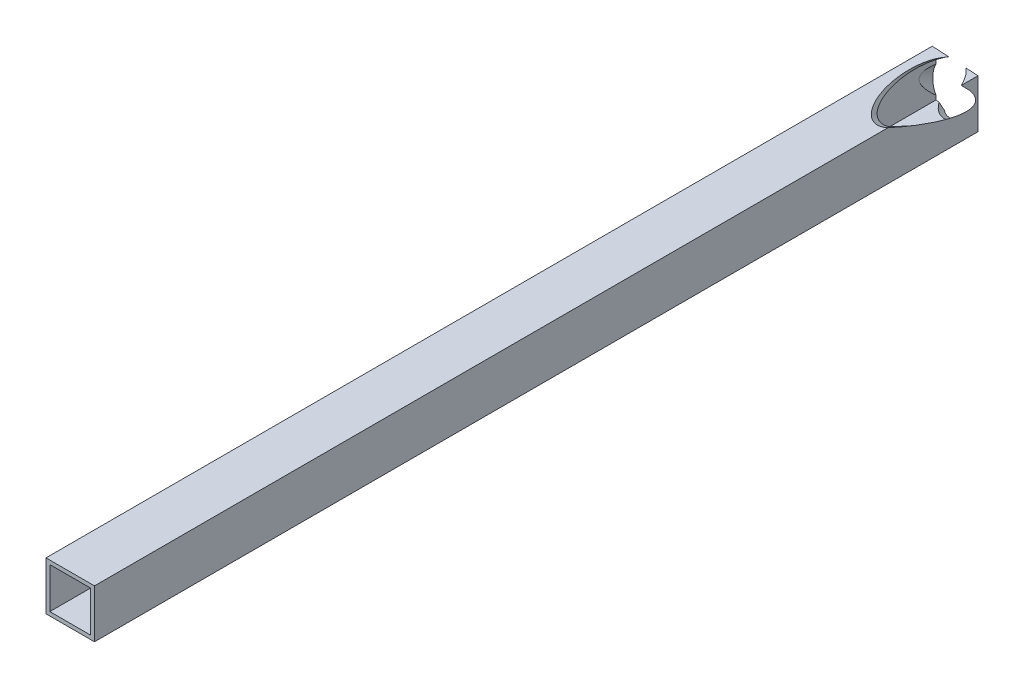
ISO-10303-21;
HEADER;
FILE_DESCRIPTION(('STEP AP214'),'2;1');
FILE_NAME('part.step','',(''),(''),'','','');
FILE_SCHEMA(('AUTOMOTIVE_DESIGN { 1 0 10303 214 1 1 1 1 }'));
ENDSEC;
DATA;
#1=APPLICATION_CONTEXT('core data for automotive mechanical design processes');
#2=APPLICATION_PROTOCOL_DEFINITION('international standard','automotive_design',2000,#1);
#3=PRODUCT_CONTEXT('',#1,'mechanical');
#4=PRODUCT('Part','Part','',(#3));
#5=PRODUCT_RELATED_PRODUCT_CATEGORY('part','',(#4));
#6=PRODUCT_DEFINITION_FORMATION('','',#4);
#7=PRODUCT_DEFINITION_CONTEXT('part definition',#1,'design');
#8=PRODUCT_DEFINITION('design','',#6,#7);
#9=PRODUCT_DEFINITION_SHAPE('','',#8);
#10=(LENGTH_UNIT() NAMED_UNIT(*) SI_UNIT(.MILLI.,.METRE.));
#11=(NAMED_UNIT(*) PLANE_ANGLE_UNIT() SI_UNIT($,.RADIAN.));
#12=(NAMED_UNIT(*) SI_UNIT($,.STERADIAN.) SOLID_ANGLE_UNIT());
#13=UNCERTAINTY_MEASURE_WITH_UNIT(LENGTH_MEASURE(1.E-05),#10,'distance_accuracy_value','');
#14=(GEOMETRIC_REPRESENTATION_CONTEXT(3) GLOBAL_UNCERTAINTY_ASSIGNED_CONTEXT((#13)) GLOBAL_UNIT_ASSIGNED_CONTEXT((#10,
#11,#12)) REPRESENTATION_CONTEXT('',''));
#15=CARTESIAN_POINT('',(0.,0.,0.));
#16=DIRECTION('',(0.,0.,1.));
#17=DIRECTION('',(1.,0.,0.));
#18=AXIS2_PLACEMENT_3D('',#15,#16,#17);
#19=CARTESIAN_POINT('',(160.,10.,-825.));
#20=DIRECTION('',(0.,-1.,0.));
#21=DIRECTION('',(0.,0.,-1.));
#22=AXIS2_PLACEMENT_3D('',#19,#20,#21);
#23=PLANE('',#22);
#24=DIRECTION('',(1.,0.,0.));
#25=VECTOR('',#24,1.);
#26=CARTESIAN_POINT('',(-150.,10.,-460.));
#27=LINE('',#26,#25);
#28=CARTESIAN_POINT('',(140.,10.,-460.));
#29=VERTEX_POINT('',#28);
#30=CARTESIAN_POINT('',(160.,10.,-460.));
#31=VERTEX_POINT('',#30);
#32=EDGE_CURVE('E182',#29,#31,#27,.T.);
#33=ORIENTED_EDGE('',*,*,#32,.T.);
#34=DIRECTION('',(0.,0.,1.));
#35=VECTOR('',#34,1.);
#36=CARTESIAN_POINT('',(160.,10.,-825.));
#37=LINE('',#36,#35);
#38=CARTESIAN_POINT('',(160.,10.,-787.277183560052));
#39=VERTEX_POINT('',#38);
#40=EDGE_CURVE('E227',#39,#31,#37,.T.);
#41=ORIENTED_EDGE('',*,*,#40,.F.);
#42=CARTESIAN_POINT('',(153.75,10.,-806.250000000001));
#43=DIRECTION('',(0.,-1.,0.));
#44=DIRECTION('',(-0.196116135138185,0.,-0.98058067569092));
#45=AXIS2_PLACEMENT_3D('',#42,#43,#44);
#46=ELLIPSE('',#45,20.4994283456881,9.49999999999999);
#47=CARTESIAN_POINT('',(147.414115676596,10.,-825.147285446627));
#48=VERTEX_POINT('',#47);
#49=EDGE_CURVE('E184',#48,#39,#46,.F.);
#50=ORIENTED_EDGE('',*,*,#49,.F.);
#51=DIRECTION('',(0.998381858973911,0.,0.0568653116741471));
#52=VECTOR('',#51,1.);
#53=CARTESIAN_POINT('',(159.967663363282,10.,-824.432267044196));
#54=LINE('',#53,#52);
#55=CARTESIAN_POINT('',(140.,10.,-825.569574769043));
#56=VERTEX_POINT('',#55);
#57=EDGE_CURVE('E165',#56,#48,#54,.T.);
#58=ORIENTED_EDGE('',*,*,#57,.F.);
#59=DIRECTION('',(0.,0.,1.));
#60=VECTOR('',#59,1.);
#61=CARTESIAN_POINT('',(140.,10.,-825.));
#62=LINE('',#61,#60);
#63=EDGE_CURVE('E43',#56,#29,#62,.T.);
#64=ORIENTED_EDGE('',*,*,#63,.T.);
#65=EDGE_LOOP('',(#33,#41,#50,#58,#64));
#66=FACE_BOUND('',#65,.T.);
#67=ADVANCED_FACE('F39',(#66),#23,.F.);
#68=CARTESIAN_POINT('',(160.,10.,-825.));
#69=DIRECTION('',(-1.,0.,0.));
#70=DIRECTION('',(0.,0.,1.));
#71=AXIS2_PLACEMENT_3D('',#68,#69,#70);
#72=PLANE('',#71);
#73=DIRECTION('',(0.,-1.,0.));
#74=VECTOR('',#73,1.);
#75=CARTESIAN_POINT('',(160.,-10.,-460.));
#76=LINE('',#75,#74);
#77=CARTESIAN_POINT('',(160.,-10.,-460.));
#78=VERTEX_POINT('',#77);
#79=EDGE_CURVE('E181',#31,#78,#76,.T.);
#80=ORIENTED_EDGE('',*,*,#79,.T.);
#81=DIRECTION('',(0.,0.,1.));
#82=VECTOR('',#81,1.);
#83=CARTESIAN_POINT('',(160.,-10.,-825.));
#84=LINE('',#83,#82);
#85=CARTESIAN_POINT('',(160.,-10.,-824.430425230957));
#86=VERTEX_POINT('',#85);
#87=EDGE_CURVE('E225',#86,#78,#84,.T.);
#88=ORIENTED_EDGE('',*,*,#87,.F.);
#89=DIRECTION('',(0.,-1.,0.));
#90=VECTOR('',#89,1.);
#91=CARTESIAN_POINT('',(160.,10.,-824.430425230957));
#92=LINE('',#91,#90);
#93=CARTESIAN_POINT('',(160.,10.,-824.430425230957));
#94=VERTEX_POINT('',#93);
#95=EDGE_CURVE('E128',#94,#86,#92,.T.);
#96=ORIENTED_EDGE('',*,*,#95,.F.);
#97=CARTESIAN_POINT('',(160.,10.,-817.517336987895));
#98=VERTEX_POINT('',#97);
#99=EDGE_CURVE('E198',#94,#98,#37,.T.);
#100=ORIENTED_EDGE('',*,*,#99,.T.);
#101=CARTESIAN_POINT('',(160.,26.6666666666671,-775.));
#102=DIRECTION('',(-1.,0.,0.));
#103=DIRECTION('',(0.,-0.470588235294118,-0.882352941176471));
#104=AXIS2_PLACEMENT_3D('',#101,#102,#103);
#105=ELLIPSE('',#104,54.6651422551681,9.49999999999999);
#106=EDGE_CURVE('E192',#39,#98,#105,.F.);
#107=ORIENTED_EDGE('',*,*,#106,.F.);
#108=ORIENTED_EDGE('',*,*,#40,.T.);
#109=EDGE_LOOP('',(#80,#88,#96,#100,#107,#108));
#110=FACE_BOUND('',#109,.T.);
#111=ADVANCED_FACE('F234',(#110),#72,.F.);
#112=CARTESIAN_POINT('',(160.,-10.,-825.));
#113=DIRECTION('',(0.,1.,0.));
#114=DIRECTION('',(0.,0.,1.));
#115=AXIS2_PLACEMENT_3D('',#112,#113,#114);
#116=PLANE('',#115);
#117=DIRECTION('',(1.,0.,0.));
#118=VECTOR('',#117,1.);
#119=CARTESIAN_POINT('',(-150.,-10.,-460.));
#120=LINE('',#119,#118);
#121=CARTESIAN_POINT('',(140.,-10.,-460.));
#122=VERTEX_POINT('',#121);
#123=EDGE_CURVE('E11',#122,#78,#120,.T.);
#124=ORIENTED_EDGE('',*,*,#123,.F.);
#125=DIRECTION('',(0.,0.,1.));
#126=VECTOR('',#125,1.);
#127=CARTESIAN_POINT('',(140.,-10.,-825.));
#128=LINE('',#127,#126);
#129=CARTESIAN_POINT('',(140.,-10.,-825.569574769043));
#130=VERTEX_POINT('',#129);
#131=EDGE_CURVE('E223',#130,#122,#128,.T.);
#132=ORIENTED_EDGE('',*,*,#131,.F.);
#133=DIRECTION('',(-0.998381858973911,0.,-0.0568653116741471));
#134=VECTOR('',#133,1.);
#135=CARTESIAN_POINT('',(159.967663363282,-10.,-824.432267044196));
#136=LINE('',#135,#134);
#137=CARTESIAN_POINT('',(145.243489746713,-10.,-825.270918822897));
#138=VERTEX_POINT('',#137);
#139=EDGE_CURVE('E168',#138,#130,#136,.T.);
#140=ORIENTED_EDGE('',*,*,#139,.F.);
#141=CARTESIAN_POINT('',(146.25,-10.,-843.750000000001));
#142=DIRECTION('',(0.,1.,0.));
#143=DIRECTION('',(-0.196116135138185,0.,-0.98058067569092));
#144=AXIS2_PLACEMENT_3D('',#141,#142,#143);
#145=ELLIPSE('',#144,20.4994283456881,9.49999999999999);
#146=CARTESIAN_POINT('',(152.585884323402,-10.,-824.852714553373));
#147=VERTEX_POINT('',#146);
#148=EDGE_CURVE('E241',#147,#138,#145,.F.);
#149=ORIENTED_EDGE('',*,*,#148,.F.);
#150=EDGE_CURVE('E121',#86,#147,#136,.T.);
#151=ORIENTED_EDGE('',*,*,#150,.F.);
#152=ORIENTED_EDGE('',*,*,#87,.T.);
#153=EDGE_LOOP('',(#124,#132,#140,#149,#151,#152));
#154=FACE_BOUND('',#153,.T.);
#155=ADVANCED_FACE('F239',(#154),#116,.F.);
#156=CARTESIAN_POINT('',(140.,10.,-825.));
#157=DIRECTION('',(1.,0.,0.));
#158=DIRECTION('',(0.,0.,-1.));
#159=AXIS2_PLACEMENT_3D('',#156,#157,#158);
#160=PLANE('',#159);
#161=DIRECTION('',(0.,-1.,0.));
#162=VECTOR('',#161,1.);
#163=CARTESIAN_POINT('',(140.,10.,-460.));
#164=LINE('',#163,#162);
#165=EDGE_CURVE('E49',#29,#122,#164,.T.);
#166=ORIENTED_EDGE('',*,*,#165,.F.);
#167=ORIENTED_EDGE('',*,*,#63,.F.);
#168=DIRECTION('',(0.,1.,0.));
#169=VECTOR('',#168,1.);
#170=CARTESIAN_POINT('',(140.,10.,-825.569574769043));
#171=LINE('',#170,#169);
#172=EDGE_CURVE('E160',#130,#56,#171,.T.);
#173=ORIENTED_EDGE('',*,*,#172,.F.);
#174=ORIENTED_EDGE('',*,*,#131,.T.);
#175=EDGE_LOOP('',(#166,#167,#173,#174));
#176=FACE_BOUND('',#175,.T.);
#177=ADVANCED_FACE('F175',(#176),#160,.F.);
#178=CARTESIAN_POINT('',(141.6,8.40000000000002,-825.));
#179=DIRECTION('',(1.,0.,0.));
#180=DIRECTION('',(0.,0.,-1.));
#181=AXIS2_PLACEMENT_3D('',#178,#179,#180);
#182=PLANE('',#181);
#183=DIRECTION('',(0.,0.,1.));
#184=VECTOR('',#183,1.);
#185=CARTESIAN_POINT('',(141.6,8.40000000000002,-825.));
#186=LINE('',#185,#184);
#187=CARTESIAN_POINT('',(141.599999999999,8.40000000000002,-825.478442805996));
#188=VERTEX_POINT('',#187);
#189=CARTESIAN_POINT('',(141.6,8.40000000000002,-460.));
#190=VERTEX_POINT('',#189);
#191=EDGE_CURVE('E208',#188,#190,#186,.T.);
#192=ORIENTED_EDGE('',*,*,#191,.T.);
#193=DIRECTION('',(0.,-1.,0.));
#194=VECTOR('',#193,1.);
#195=CARTESIAN_POINT('',(141.6,8.40000000000002,-460.));
#196=LINE('',#195,#194);
#197=CARTESIAN_POINT('',(141.6,-8.39999999999999,-460.));
#198=VERTEX_POINT('',#197);
#199=EDGE_CURVE('E204',#190,#198,#196,.T.);
#200=ORIENTED_EDGE('',*,*,#199,.T.);
#201=DIRECTION('',(0.,0.,1.));
#202=VECTOR('',#201,1.);
#203=CARTESIAN_POINT('',(141.6,-8.39999999999999,-825.));
#204=LINE('',#203,#202);
#205=CARTESIAN_POINT('',(141.599999999999,-8.39999999999999,-825.478442805996));
#206=VERTEX_POINT('',#205);
#207=EDGE_CURVE('E210',#206,#198,#204,.T.);
#208=ORIENTED_EDGE('',*,*,#207,.F.);
#209=DIRECTION('',(0.,1.,0.));
#210=VECTOR('',#209,1.);
#211=CARTESIAN_POINT('',(141.6,8.40000000000002,-825.478442805996));
#212=LINE('',#211,#210);
#213=CARTESIAN_POINT('',(141.6,-6.6285498426136,-825.478442805996));
#214=VERTEX_POINT('',#213);
#215=EDGE_CURVE('E207',#206,#214,#212,.T.);
#216=ORIENTED_EDGE('',*,*,#215,.T.);
#217=CARTESIAN_POINT('',(141.6,-22.3999999999994,-867.));
#218=DIRECTION('',(1.,0.,0.));
#219=DIRECTION('',(0.,-0.470588235294118,-0.882352941176471));
#220=AXIS2_PLACEMENT_3D('',#217,#218,#219);
#221=ELLIPSE('',#220,54.6651422551681,9.49999999999999);
#222=CARTESIAN_POINT('',(141.6,4.41476234928546,-825.478442805996));
#223=VERTEX_POINT('',#222);
#224=EDGE_CURVE('E268',#214,#223,#221,.F.);
#225=ORIENTED_EDGE('',*,*,#224,.T.);
#226=EDGE_CURVE('E220',#223,#188,#212,.T.);
#227=ORIENTED_EDGE('',*,*,#226,.T.);
#228=EDGE_LOOP('',(#192,#200,#208,#216,#225,#227));
#229=FACE_BOUND('',#228,.T.);
#230=ADVANCED_FACE('F308',(#229),#182,.T.);
#231=CARTESIAN_POINT('',(158.4,-8.39999999999999,-825.));
#232=DIRECTION('',(0.,1.,0.));
#233=DIRECTION('',(0.,0.,1.));
#234=AXIS2_PLACEMENT_3D('',#231,#232,#233);
#235=PLANE('',#234);
#236=ORIENTED_EDGE('',*,*,#207,.T.);
#237=DIRECTION('',(1.,0.,0.));
#238=VECTOR('',#237,1.);
#239=CARTESIAN_POINT('',(158.4,-8.39999999999999,-460.));
#240=LINE('',#239,#238);
#241=CARTESIAN_POINT('',(158.400000000001,-8.39999999999999,-460.));
#242=VERTEX_POINT('',#241);
#243=EDGE_CURVE('E67',#198,#242,#240,.T.);
#244=ORIENTED_EDGE('',*,*,#243,.T.);
#245=DIRECTION('',(0.,0.,1.));
#246=VECTOR('',#245,1.);
#247=CARTESIAN_POINT('',(158.4,-8.39999999999999,-825.));
#248=LINE('',#247,#246);
#249=CARTESIAN_POINT('',(158.4,-8.39999999999999,-824.521557194004));
#250=VERTEX_POINT('',#249);
#251=EDGE_CURVE('E213',#250,#242,#248,.T.);
#252=ORIENTED_EDGE('',*,*,#251,.F.);
#253=DIRECTION('',(-0.998381858973911,0.,-0.0568653116741471));
#254=VECTOR('',#253,1.);
#255=CARTESIAN_POINT('',(158.372837225157,-8.39999999999999,-824.523104317125));
#256=LINE('',#255,#254);
#257=CARTESIAN_POINT('',(155.202122253573,-8.39999999999999,-824.703700241889));
#258=VERTEX_POINT('',#257);
#259=EDGE_CURVE('E151',#250,#258,#256,.T.);
#260=ORIENTED_EDGE('',*,*,#259,.T.);
#261=CARTESIAN_POINT('',(146.85,-8.39999999999999,-840.750000000001));
#262=DIRECTION('',(0.,1.,0.));
#263=DIRECTION('',(-0.196116135138185,0.,-0.98058067569092));
#264=AXIS2_PLACEMENT_3D('',#261,#262,#263);
#265=ELLIPSE('',#264,20.4994283456881,9.49999999999999);
#266=CARTESIAN_POINT('',(142.974551965323,-8.39999999999999,-825.400151794177));
#267=VERTEX_POINT('',#266);
#268=EDGE_CURVE('E251',#258,#267,#265,.F.);
#269=ORIENTED_EDGE('',*,*,#268,.T.);
#270=EDGE_CURVE('E218',#267,#206,#256,.T.);
#271=ORIENTED_EDGE('',*,*,#270,.T.);
#272=EDGE_LOOP('',(#236,#244,#252,#260,#269,#271));
#273=FACE_BOUND('',#272,.T.);
#274=ADVANCED_FACE('F264',(#273),#235,.T.);
#275=CARTESIAN_POINT('',(158.4,8.39999999999999,-825.));
#276=DIRECTION('',(-1.,0.,0.));
#277=DIRECTION('',(0.,0.,1.));
#278=AXIS2_PLACEMENT_3D('',#275,#276,#277);
#279=PLANE('',#278);
#280=ORIENTED_EDGE('',*,*,#251,.T.);
#281=DIRECTION('',(0.,1.,0.));
#282=VECTOR('',#281,1.);
#283=CARTESIAN_POINT('',(158.4,8.39999999999999,-460.));
#284=LINE('',#283,#282);
#285=CARTESIAN_POINT('',(158.4,8.39999999999999,-460.));
#286=VERTEX_POINT('',#285);
#287=EDGE_CURVE('E70',#242,#286,#284,.T.);
#288=ORIENTED_EDGE('',*,*,#287,.T.);
#289=DIRECTION('',(0.,0.,1.));
#290=VECTOR('',#289,1.);
#291=CARTESIAN_POINT('',(158.4,8.39999999999999,-825.));
#292=LINE('',#291,#290);
#293=CARTESIAN_POINT('',(158.4,8.39999999999999,-789.588895427201));
#294=VERTEX_POINT('',#293);
#295=EDGE_CURVE('E203',#294,#286,#292,.T.);
#296=ORIENTED_EDGE('',*,*,#295,.F.);
#297=CARTESIAN_POINT('',(158.4,22.4000000000004,-783.));
#298=DIRECTION('',(-1.,0.,0.));
#299=DIRECTION('',(0.,-0.470588235294118,-0.882352941176471));
#300=AXIS2_PLACEMENT_3D('',#297,#298,#299);
#301=ELLIPSE('',#300,54.6651422551681,9.49999999999999);
#302=CARTESIAN_POINT('',(158.4,-4.41476234928452,-824.521557194004));
#303=VERTEX_POINT('',#302);
#304=EDGE_CURVE('E212',#294,#303,#301,.F.);
#305=ORIENTED_EDGE('',*,*,#304,.T.);
#306=DIRECTION('',(0.,-1.,0.));
#307=VECTOR('',#306,1.);
#308=CARTESIAN_POINT('',(158.4,8.39999999999999,-824.521557194004));
#309=LINE('',#308,#307);
#310=EDGE_CURVE('E147',#303,#250,#309,.T.);
#311=ORIENTED_EDGE('',*,*,#310,.T.);
#312=EDGE_LOOP('',(#280,#288,#296,#305,#311));
#313=FACE_BOUND('',#312,.T.);
#314=ADVANCED_FACE('F306',(#313),#279,.T.);
#315=CARTESIAN_POINT('',(158.4,8.39999999999999,-825.));
#316=DIRECTION('',(0.,-1.,0.));
#317=DIRECTION('',(1.,0.,0.));
#318=AXIS2_PLACEMENT_3D('',#315,#316,#317);
#319=PLANE('',#318);
#320=ORIENTED_EDGE('',*,*,#295,.T.);
#321=DIRECTION('',(-1.,0.,0.));
#322=VECTOR('',#321,1.);
#323=CARTESIAN_POINT('',(158.4,8.39999999999999,-460.));
#324=LINE('',#323,#322);
#325=EDGE_CURVE('E58',#286,#190,#324,.T.);
#326=ORIENTED_EDGE('',*,*,#325,.T.);
#327=ORIENTED_EDGE('',*,*,#191,.F.);
#328=DIRECTION('',(0.998381858973911,0.,0.0568653116741471));
#329=VECTOR('',#328,1.);
#330=CARTESIAN_POINT('',(158.372837225157,8.39999999999999,-824.523104317125));
#331=LINE('',#330,#329);
#332=CARTESIAN_POINT('',(144.797877746425,8.40000000000001,-825.296299758111));
#333=VERTEX_POINT('',#332);
#334=EDGE_CURVE('E202',#188,#333,#331,.T.);
#335=ORIENTED_EDGE('',*,*,#334,.T.);
#336=CARTESIAN_POINT('',(153.15,8.39999999999999,-809.250000000001));
#337=DIRECTION('',(0.,-1.,0.));
#338=DIRECTION('',(-0.196116135138184,0.,-0.98058067569092));
#339=AXIS2_PLACEMENT_3D('',#336,#337,#338);
#340=ELLIPSE('',#339,20.499428345688,9.49999999999999);
#341=EDGE_CURVE('E276',#333,#294,#340,.F.);
#342=ORIENTED_EDGE('',*,*,#341,.T.);
#343=EDGE_LOOP('',(#320,#326,#327,#335,#342));
#344=FACE_BOUND('',#343,.T.);
#345=ADVANCED_FACE('F305',(#344),#319,.T.);
#346=CARTESIAN_POINT('',(154.756510253289,10.,-824.729081177103));
#347=VERTEX_POINT('',#346);
#348=EDGE_CURVE('E186',#347,#94,#54,.T.);
#349=ORIENTED_EDGE('',*,*,#348,.F.);
#350=EDGE_CURVE('E195',#98,#347,#46,.F.);
#351=ORIENTED_EDGE('',*,*,#350,.F.);
#352=ORIENTED_EDGE('',*,*,#99,.F.);
#353=EDGE_LOOP('',(#349,#351,#352));
#354=FACE_BOUND('',#353,.T.);
#355=ADVANCED_FACE('F287',(#354),#23,.F.);
#356=CARTESIAN_POINT('',(158.4,8.39999999999999,-824.521557194004));
#357=VERTEX_POINT('',#356);
#358=CARTESIAN_POINT('',(158.4,8.39999999999999,-822.438501833074));
#359=VERTEX_POINT('',#358);
#360=EDGE_CURVE('E214',#357,#359,#292,.T.);
#361=ORIENTED_EDGE('',*,*,#360,.F.);
#362=CARTESIAN_POINT('',(158.4,6.62854984261455,-824.521557194004));
#363=VERTEX_POINT('',#362);
#364=EDGE_CURVE('E297',#357,#363,#309,.T.);
#365=ORIENTED_EDGE('',*,*,#364,.T.);
#366=EDGE_CURVE('E275',#363,#359,#301,.F.);
#367=ORIENTED_EDGE('',*,*,#366,.T.);
#368=EDGE_LOOP('',(#361,#365,#367));
#369=FACE_BOUND('',#368,.T.);
#370=ADVANCED_FACE('F296',(#369),#279,.T.);
#371=CARTESIAN_POINT('',(157.025448034678,8.39999999999999,-824.599848205823));
#372=VERTEX_POINT('',#371);
#373=EDGE_CURVE('E274',#359,#372,#340,.F.);
#374=ORIENTED_EDGE('',*,*,#373,.T.);
#375=EDGE_CURVE('E79',#372,#357,#331,.T.);
#376=ORIENTED_EDGE('',*,*,#375,.T.);
#377=ORIENTED_EDGE('',*,*,#360,.T.);
#378=EDGE_LOOP('',(#374,#376,#377));
#379=FACE_BOUND('',#378,.T.);
#380=ADVANCED_FACE('F293',(#379),#319,.T.);
#381=CARTESIAN_POINT('',(225.,200.,-450.000000000001));
#382=DIRECTION('',(-0.173785333909048,-0.463427557090794,-0.868926669545238));
#383=DIRECTION('',(0.,0.882352941176471,-0.470588235294118));
#384=AXIS2_PLACEMENT_3D('',#381,#382,#383);
#385=CYLINDRICAL_SURFACE('',#384,9.49999999999999);
#386=ORIENTED_EDGE('',*,*,#341,.F.);
#387=CARTESIAN_POINT('',(150.,4.71844785465692E-13,-825.));
#388=DIRECTION('',(0.0568653116741471,0.,-0.998381858973911));
#389=DIRECTION('',(-0.432773380838636,-0.901165686275887,-0.0246496798438988));
#390=AXIS2_PLACEMENT_3D('',#387,#388,#389);
#391=ELLIPSE('',#390,11.0769311157735,9.49999999999999);
#392=EDGE_CURVE('E216',#333,#48,#391,.T.);
#393=ORIENTED_EDGE('',*,*,#392,.T.);
#394=ORIENTED_EDGE('',*,*,#49,.T.);
#395=ORIENTED_EDGE('',*,*,#106,.T.);
#396=ORIENTED_EDGE('',*,*,#350,.T.);
#397=EDGE_CURVE('E273',#347,#372,#391,.T.);
#398=ORIENTED_EDGE('',*,*,#397,.T.);
#399=ORIENTED_EDGE('',*,*,#373,.F.);
#400=ORIENTED_EDGE('',*,*,#366,.F.);
#401=EDGE_CURVE('E255',#363,#303,#391,.T.);
#402=ORIENTED_EDGE('',*,*,#401,.T.);
#403=ORIENTED_EDGE('',*,*,#304,.F.);
#404=EDGE_LOOP('',(#386,#393,#394,#395,#396,#398,#399,#400,#402,#403));
#405=FACE_BOUND('',#404,.T.);
#406=ADVANCED_FACE('F283',(#405),#385,.F.);
#407=ORIENTED_EDGE('',*,*,#224,.F.);
#408=CARTESIAN_POINT('',(150.,4.71844785465692E-13,-825.));
#409=DIRECTION('',(0.0568653116741471,0.,-0.998381858973911));
#410=DIRECTION('',(-0.432773380838636,-0.901165686275887,-0.0246496798438988));
#411=AXIS2_PLACEMENT_3D('',#408,#409,#410);
#412=ELLIPSE('',#411,11.0769311157735,9.49999999999999);
#413=EDGE_CURVE('E252',#214,#223,#412,.T.);
#414=ORIENTED_EDGE('',*,*,#413,.T.);
#415=EDGE_LOOP('',(#407,#414));
#416=FACE_BOUND('',#415,.T.);
#417=ADVANCED_FACE('F340',(#416),#385,.F.);
#418=ORIENTED_EDGE('',*,*,#268,.F.);
#419=EDGE_CURVE('E246',#258,#147,#412,.T.);
#420=ORIENTED_EDGE('',*,*,#419,.T.);
#421=ORIENTED_EDGE('',*,*,#148,.T.);
#422=EDGE_CURVE('E245',#138,#267,#412,.T.);
#423=ORIENTED_EDGE('',*,*,#422,.T.);
#424=EDGE_LOOP('',(#418,#420,#421,#423));
#425=FACE_BOUND('',#424,.T.);
#426=ADVANCED_FACE('F249',(#425),#385,.F.);
#427=CARTESIAN_POINT('',(150.,0.,-825.));
#428=DIRECTION('',(0.0568653116741471,0.,-0.998381858973911));
#429=DIRECTION('',(-0.998381858973911,0.,-0.0568653116741471));
#430=AXIS2_PLACEMENT_3D('',#427,#428,#429);
#431=PLANE('',#430);
#432=ORIENTED_EDGE('',*,*,#392,.F.);
#433=ORIENTED_EDGE('',*,*,#334,.F.);
#434=ORIENTED_EDGE('',*,*,#226,.F.);
#435=ORIENTED_EDGE('',*,*,#413,.F.);
#436=ORIENTED_EDGE('',*,*,#215,.F.);
#437=ORIENTED_EDGE('',*,*,#270,.F.);
#438=ORIENTED_EDGE('',*,*,#422,.F.);
#439=ORIENTED_EDGE('',*,*,#139,.T.);
#440=ORIENTED_EDGE('',*,*,#172,.T.);
#441=ORIENTED_EDGE('',*,*,#57,.T.);
#442=EDGE_LOOP('',(#432,#433,#434,#435,#436,#437,#438,#439,#440,#441));
#443=FACE_BOUND('',#442,.T.);
#444=ADVANCED_FACE('F163',(#443),#431,.T.);
#445=ORIENTED_EDGE('',*,*,#397,.F.);
#446=ORIENTED_EDGE('',*,*,#348,.T.);
#447=ORIENTED_EDGE('',*,*,#95,.T.);
#448=ORIENTED_EDGE('',*,*,#150,.T.);
#449=ORIENTED_EDGE('',*,*,#419,.F.);
#450=ORIENTED_EDGE('',*,*,#259,.F.);
#451=ORIENTED_EDGE('',*,*,#310,.F.);
#452=ORIENTED_EDGE('',*,*,#401,.F.);
#453=ORIENTED_EDGE('',*,*,#364,.F.);
#454=ORIENTED_EDGE('',*,*,#375,.F.);
#455=EDGE_LOOP('',(#445,#446,#447,#448,#449,#450,#451,#452,#453,#454));
#456=FACE_BOUND('',#455,.T.);
#457=ADVANCED_FACE('F288',(#456),#431,.T.);
#458=CARTESIAN_POINT('',(-150.,-10.,-460.));
#459=DIRECTION('',(0.,0.,1.));
#460=DIRECTION('',(1.,0.,0.));
#461=AXIS2_PLACEMENT_3D('',#458,#459,#460);
#462=PLANE('',#461);
#463=ORIENTED_EDGE('',*,*,#287,.F.);
#464=ORIENTED_EDGE('',*,*,#243,.F.);
#465=ORIENTED_EDGE('',*,*,#199,.F.);
#466=ORIENTED_EDGE('',*,*,#325,.F.);
#467=EDGE_LOOP('',(#463,#464,#465,#466));
#468=FACE_BOUND('',#467,.T.);
#469=ORIENTED_EDGE('',*,*,#165,.T.);
#470=ORIENTED_EDGE('',*,*,#123,.T.);
#471=ORIENTED_EDGE('',*,*,#79,.F.);
#472=ORIENTED_EDGE('',*,*,#32,.F.);
#473=EDGE_LOOP('',(#469,#470,#471,#472));
#474=FACE_BOUND('',#473,.T.);
#475=ADVANCED_FACE('F41',(#468,#474),#462,.T.);
#476=CLOSED_SHELL('',(#67,#111,#155,#177,#230,#274,#314,#345,#355,#370,#380,#406,#417,#426,#444,
#457,#475));
#477=MANIFOLD_SOLID_BREP('B2',#476);
#478=ADVANCED_BREP_SHAPE_REPRESENTATION('',(#18,#477),#14);
#479=SHAPE_DEFINITION_REPRESENTATION(#9,#478);
ENDSEC;
END-ISO-10303-21;
